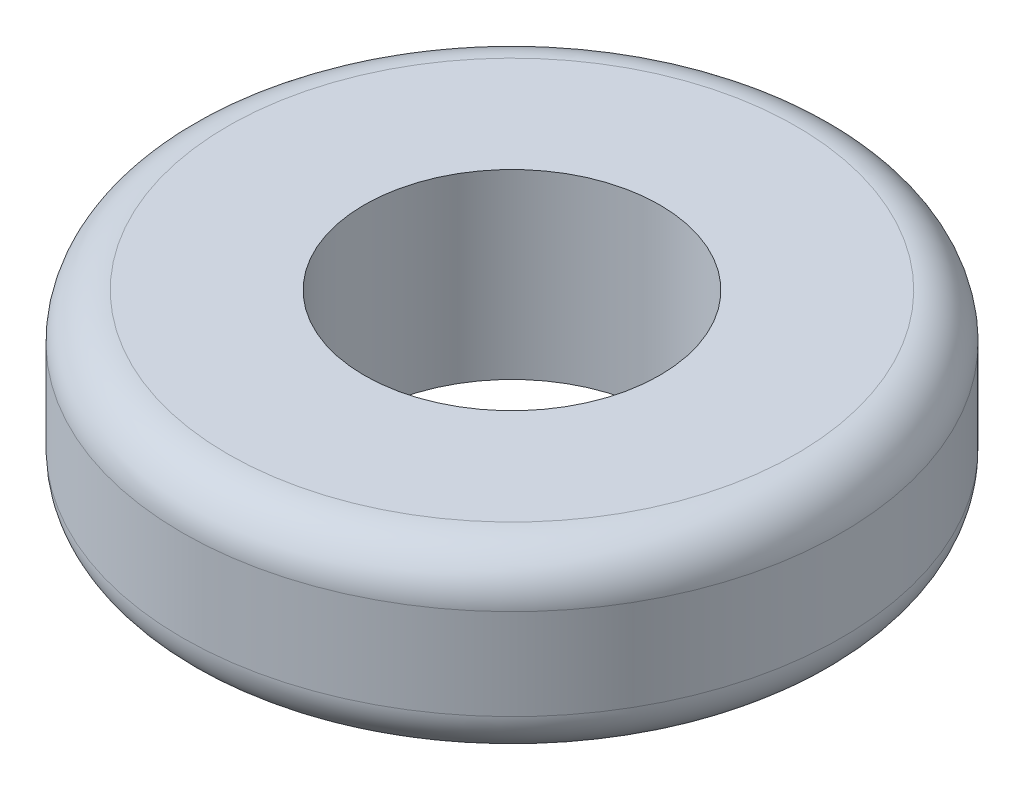
ISO-10303-21;
HEADER;
FILE_DESCRIPTION(('STEP AP214'),'2;1');
FILE_NAME('part.step','',(''),(''),'','','');
FILE_SCHEMA(('AUTOMOTIVE_DESIGN { 1 0 10303 214 1 1 1 1 }'));
ENDSEC;
DATA;
#1=APPLICATION_CONTEXT('core data for automotive mechanical design processes');
#2=APPLICATION_PROTOCOL_DEFINITION('international standard','automotive_design',2000,#1);
#3=PRODUCT_CONTEXT('',#1,'mechanical');
#4=PRODUCT('Part','Part','',(#3));
#5=PRODUCT_RELATED_PRODUCT_CATEGORY('part','',(#4));
#6=PRODUCT_DEFINITION_FORMATION('','',#4);
#7=PRODUCT_DEFINITION_CONTEXT('part definition',#1,'design');
#8=PRODUCT_DEFINITION('design','',#6,#7);
#9=PRODUCT_DEFINITION_SHAPE('','',#8);
#10=(LENGTH_UNIT() NAMED_UNIT(*) SI_UNIT(.MILLI.,.METRE.));
#11=(NAMED_UNIT(*) PLANE_ANGLE_UNIT() SI_UNIT($,.RADIAN.));
#12=(NAMED_UNIT(*) SI_UNIT($,.STERADIAN.) SOLID_ANGLE_UNIT());
#13=UNCERTAINTY_MEASURE_WITH_UNIT(LENGTH_MEASURE(1.E-05),#10,'distance_accuracy_value','');
#14=(GEOMETRIC_REPRESENTATION_CONTEXT(3) GLOBAL_UNCERTAINTY_ASSIGNED_CONTEXT((#13)) GLOBAL_UNIT_ASSIGNED_CONTEXT((#10,
#11,#12)) REPRESENTATION_CONTEXT('',''));
#15=CARTESIAN_POINT('',(0.,0.,0.));
#16=DIRECTION('',(0.,0.,1.));
#17=DIRECTION('',(1.,0.,0.));
#18=AXIS2_PLACEMENT_3D('',#15,#16,#17);
#19=CARTESIAN_POINT('',(0.,4.,0.));
#20=DIRECTION('',(0.,1.,0.));
#21=DIRECTION('',(0.,0.,1.));
#22=AXIS2_PLACEMENT_3D('',#19,#20,#21);
#23=PLANE('',#22);
#24=CARTESIAN_POINT('',(0.,4.,0.));
#25=DIRECTION('',(0.,1.,0.));
#26=DIRECTION('',(0.,0.,1.));
#27=AXIS2_PLACEMENT_3D('',#24,#25,#26);
#28=CIRCLE('',#27,6.25);
#29=CARTESIAN_POINT('',(0.,4.,6.25));
#30=VERTEX_POINT('',#29);
#31=EDGE_CURVE('E59',#30,#30,#28,.T.);
#32=ORIENTED_EDGE('',*,*,#31,.T.);
#33=EDGE_LOOP('',(#32));
#34=FACE_BOUND('',#33,.T.);
#35=CARTESIAN_POINT('',(0.,4.,0.));
#36=DIRECTION('',(0.,1.,0.));
#37=DIRECTION('',(0.,0.,1.));
#38=AXIS2_PLACEMENT_3D('',#35,#36,#37);
#39=CIRCLE('',#38,3.25);
#40=CARTESIAN_POINT('',(0.,4.,3.25));
#41=VERTEX_POINT('',#40);
#42=EDGE_CURVE('E64',#41,#41,#39,.T.);
#43=ORIENTED_EDGE('',*,*,#42,.F.);
#44=EDGE_LOOP('',(#43));
#45=FACE_BOUND('',#44,.T.);
#46=ADVANCED_FACE('F44',(#34,#45),#23,.T.);
#47=CARTESIAN_POINT('',(0.,0.,0.));
#48=DIRECTION('',(0.,1.,0.));
#49=DIRECTION('',(0.,0.,1.));
#50=AXIS2_PLACEMENT_3D('',#47,#48,#49);
#51=PLANE('',#50);
#52=CARTESIAN_POINT('',(0.,0.,0.));
#53=DIRECTION('',(0.,1.,0.));
#54=DIRECTION('',(0.,0.,1.));
#55=AXIS2_PLACEMENT_3D('',#52,#53,#54);
#56=CIRCLE('',#55,6.25);
#57=CARTESIAN_POINT('',(0.,0.,6.25));
#58=VERTEX_POINT('',#57);
#59=EDGE_CURVE('E12',#58,#58,#56,.F.);
#60=ORIENTED_EDGE('',*,*,#59,.T.);
#61=EDGE_LOOP('',(#60));
#62=FACE_BOUND('',#61,.T.);
#63=CARTESIAN_POINT('',(0.,0.,0.));
#64=DIRECTION('',(0.,1.,0.));
#65=DIRECTION('',(0.,0.,1.));
#66=AXIS2_PLACEMENT_3D('',#63,#64,#65);
#67=CIRCLE('',#66,3.25);
#68=CARTESIAN_POINT('',(0.,0.,3.25));
#69=VERTEX_POINT('',#68);
#70=EDGE_CURVE('E65',#69,#69,#67,.T.);
#71=ORIENTED_EDGE('',*,*,#70,.T.);
#72=EDGE_LOOP('',(#71));
#73=FACE_BOUND('',#72,.T.);
#74=ADVANCED_FACE('F75',(#62,#73),#51,.F.);
#75=CARTESIAN_POINT('',(0.,4.,0.));
#76=DIRECTION('',(0.,-1.,0.));
#77=DIRECTION('',(0.,0.,-1.));
#78=AXIS2_PLACEMENT_3D('',#75,#76,#77);
#79=CYLINDRICAL_SURFACE('',#78,7.25);
#80=CARTESIAN_POINT('',(0.,3.,0.));
#81=DIRECTION('',(0.,1.,0.));
#82=DIRECTION('',(0.,0.,1.));
#83=AXIS2_PLACEMENT_3D('',#80,#81,#82);
#84=CIRCLE('',#83,7.25);
#85=CARTESIAN_POINT('',(0.,3.,7.25));
#86=VERTEX_POINT('',#85);
#87=EDGE_CURVE('E51',#86,#86,#84,.F.);
#88=ORIENTED_EDGE('',*,*,#87,.T.);
#89=EDGE_LOOP('',(#88));
#90=FACE_BOUND('',#89,.T.);
#91=CARTESIAN_POINT('',(0.,1.,0.));
#92=DIRECTION('',(0.,1.,0.));
#93=DIRECTION('',(0.,0.,1.));
#94=AXIS2_PLACEMENT_3D('',#91,#92,#93);
#95=CIRCLE('',#94,7.25);
#96=CARTESIAN_POINT('',(0.,1.,7.25));
#97=VERTEX_POINT('',#96);
#98=EDGE_CURVE('E55',#97,#97,#95,.T.);
#99=ORIENTED_EDGE('',*,*,#98,.T.);
#100=EDGE_LOOP('',(#99));
#101=FACE_BOUND('',#100,.T.);
#102=ADVANCED_FACE('F81',(#90,#101),#79,.T.);
#103=CARTESIAN_POINT('',(0.,4.,0.));
#104=DIRECTION('',(0.,-1.,0.));
#105=DIRECTION('',(0.,0.,-1.));
#106=AXIS2_PLACEMENT_3D('',#103,#104,#105);
#107=CYLINDRICAL_SURFACE('',#106,3.25);
#108=ORIENTED_EDGE('',*,*,#42,.T.);
#109=EDGE_LOOP('',(#108));
#110=FACE_BOUND('',#109,.T.);
#111=ORIENTED_EDGE('',*,*,#70,.F.);
#112=EDGE_LOOP('',(#111));
#113=FACE_BOUND('',#112,.T.);
#114=ADVANCED_FACE('F71',(#110,#113),#107,.F.);
#115=CARTESIAN_POINT('',(0.,3.,0.));
#116=DIRECTION('',(0.,1.,0.));
#117=DIRECTION('',(0.,0.,1.));
#118=AXIS2_PLACEMENT_3D('',#115,#116,#117);
#119=TOROIDAL_SURFACE('',#118,6.25,1.);
#120=ORIENTED_EDGE('',*,*,#87,.F.);
#121=EDGE_LOOP('',(#120));
#122=FACE_BOUND('',#121,.T.);
#123=ORIENTED_EDGE('',*,*,#31,.F.);
#124=EDGE_LOOP('',(#123));
#125=FACE_BOUND('',#124,.T.);
#126=ADVANCED_FACE('F86',(#122,#125),#119,.T.);
#127=CARTESIAN_POINT('',(0.,1.,0.));
#128=DIRECTION('',(0.,1.,0.));
#129=DIRECTION('',(0.,0.,1.));
#130=AXIS2_PLACEMENT_3D('',#127,#128,#129);
#131=TOROIDAL_SURFACE('',#130,6.25,1.);
#132=ORIENTED_EDGE('',*,*,#59,.F.);
#133=EDGE_LOOP('',(#132));
#134=FACE_BOUND('',#133,.T.);
#135=ORIENTED_EDGE('',*,*,#98,.F.);
#136=EDGE_LOOP('',(#135));
#137=FACE_BOUND('',#136,.T.);
#138=ADVANCED_FACE('F46',(#134,#137),#131,.T.);
#139=CLOSED_SHELL('',(#46,#74,#102,#114,#126,#138));
#140=MANIFOLD_SOLID_BREP('B2',#139);
#141=ADVANCED_BREP_SHAPE_REPRESENTATION('',(#18,#140),#14);
#142=SHAPE_DEFINITION_REPRESENTATION(#9,#141);
ENDSEC;
END-ISO-10303-21;
